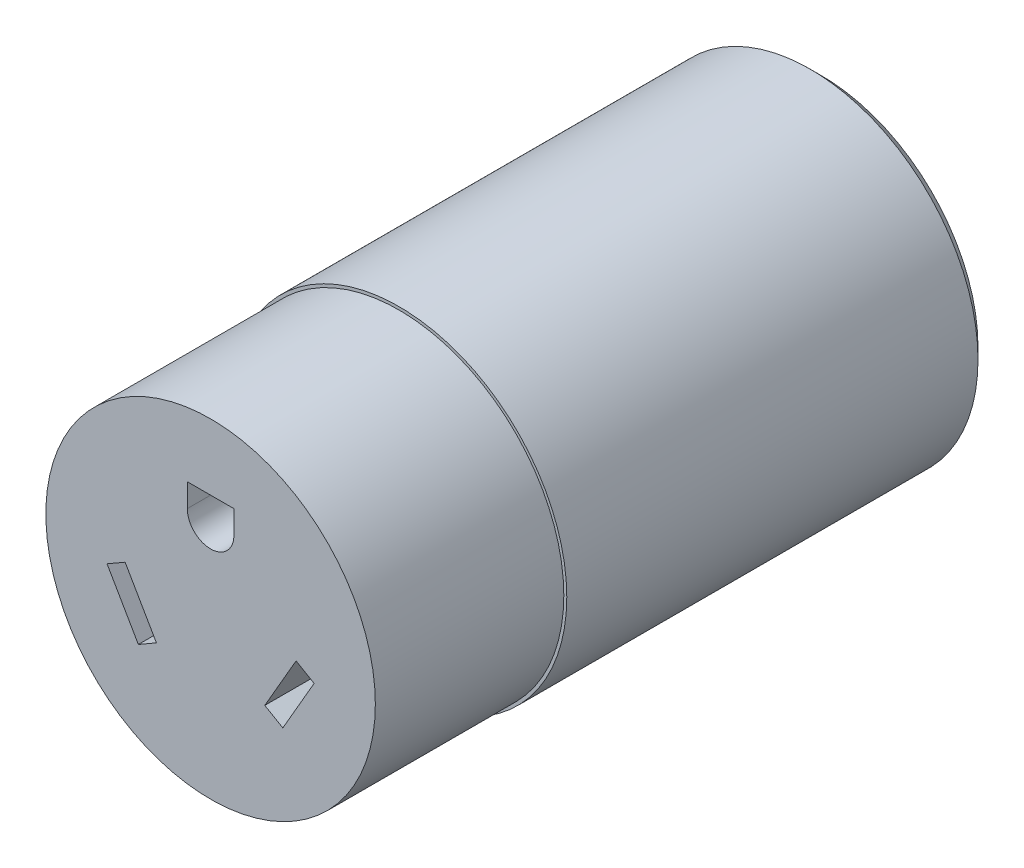
ISO-10303-21;
HEADER;
FILE_DESCRIPTION(('STEP AP214'),'2;1');
FILE_NAME('part.step','',(''),(''),'','','');
FILE_SCHEMA(('AUTOMOTIVE_DESIGN { 1 0 10303 214 1 1 1 1 }'));
ENDSEC;
DATA;
#1=APPLICATION_CONTEXT('core data for automotive mechanical design processes');
#2=APPLICATION_PROTOCOL_DEFINITION('international standard','automotive_design',2000,#1);
#3=PRODUCT_CONTEXT('',#1,'mechanical');
#4=PRODUCT('Part','Part','',(#3));
#5=PRODUCT_RELATED_PRODUCT_CATEGORY('part','',(#4));
#6=PRODUCT_DEFINITION_FORMATION('','',#4);
#7=PRODUCT_DEFINITION_CONTEXT('part definition',#1,'design');
#8=PRODUCT_DEFINITION('design','',#6,#7);
#9=PRODUCT_DEFINITION_SHAPE('','',#8);
#10=(LENGTH_UNIT() NAMED_UNIT(*) SI_UNIT(.MILLI.,.METRE.));
#11=(NAMED_UNIT(*) PLANE_ANGLE_UNIT() SI_UNIT($,.RADIAN.));
#12=(NAMED_UNIT(*) SI_UNIT($,.STERADIAN.) SOLID_ANGLE_UNIT());
#13=UNCERTAINTY_MEASURE_WITH_UNIT(LENGTH_MEASURE(1.E-05),#10,'distance_accuracy_value','');
#14=(GEOMETRIC_REPRESENTATION_CONTEXT(3) GLOBAL_UNCERTAINTY_ASSIGNED_CONTEXT((#13)) GLOBAL_UNIT_ASSIGNED_CONTEXT((#10,
#11,#12)) REPRESENTATION_CONTEXT('',''));
#15=CARTESIAN_POINT('',(0.,0.,0.));
#16=DIRECTION('',(0.,0.,1.));
#17=DIRECTION('',(1.,0.,0.));
#18=AXIS2_PLACEMENT_3D('',#15,#16,#17);
#19=CARTESIAN_POINT('',(0.,0.,0.));
#20=DIRECTION('',(0.,0.,-1.));
#21=DIRECTION('',(-1.,0.,0.));
#22=AXIS2_PLACEMENT_3D('',#19,#20,#21);
#23=PLANE('',#22);
#24=DIRECTION('',(-0.866025403784445,0.499999999999989,0.));
#25=VECTOR('',#24,1.);
#26=CARTESIAN_POINT('',(11.9732096496661,-1.45647105100187,0.));
#27=LINE('',#26,#25);
#28=CARTESIAN_POINT('',(11.9732096496661,-1.45647105100187,0.));
#29=VERTEX_POINT('',#28);
#30=CARTESIAN_POINT('',(9.88349035033421,-0.249971051001905,0.));
#31=VERTEX_POINT('',#30);
#32=EDGE_CURVE('E133',#29,#31,#27,.T.);
#33=ORIENTED_EDGE('',*,*,#32,.F.);
#34=DIRECTION('',(0.499999999999989,0.866025403784445,0.));
#35=VECTOR('',#34,1.);
#36=CARTESIAN_POINT('',(8.35370964966615,-7.72562894899747,0.));
#37=LINE('',#36,#35);
#38=CARTESIAN_POINT('',(8.35370964966615,-7.72562894899747,0.));
#39=VERTEX_POINT('',#38);
#40=EDGE_CURVE('E30',#39,#29,#37,.T.);
#41=ORIENTED_EDGE('',*,*,#40,.F.);
#42=DIRECTION('',(0.866025403784445,-0.499999999999989,0.));
#43=VECTOR('',#42,1.);
#44=CARTESIAN_POINT('',(8.35370964966615,-7.72562894899747,0.));
#45=LINE('',#44,#43);
#46=CARTESIAN_POINT('',(6.26399035033429,-6.5191289489975,0.));
#47=VERTEX_POINT('',#46);
#48=EDGE_CURVE('E124',#47,#39,#45,.T.);
#49=ORIENTED_EDGE('',*,*,#48,.F.);
#50=DIRECTION('',(-0.499999999999989,-0.866025403784445,0.));
#51=VECTOR('',#50,1.);
#52=CARTESIAN_POINT('',(6.26399035033429,-6.5191289489975,0.));
#53=LINE('',#52,#51);
#54=EDGE_CURVE('E127',#31,#47,#53,.T.);
#55=ORIENTED_EDGE('',*,*,#54,.F.);
#56=EDGE_LOOP('',(#33,#41,#49,#55));
#57=FACE_BOUND('',#56,.T.);
#58=DIRECTION('',(0.866025403784438,0.500000000000002,0.));
#59=VECTOR('',#58,1.);
#60=CARTESIAN_POINT('',(-8.35370964966592,-7.72562894899777,0.));
#61=LINE('',#60,#59);
#62=CARTESIAN_POINT('',(-8.35370964966592,-7.72562894899777,0.));
#63=VERTEX_POINT('',#62);
#64=CARTESIAN_POINT('',(-6.26399035033407,-6.51912894899777,0.));
#65=VERTEX_POINT('',#64);
#66=EDGE_CURVE('E157',#63,#65,#61,.T.);
#67=ORIENTED_EDGE('',*,*,#66,.F.);
#68=DIRECTION('',(0.500000000000001,-0.866025403784438,0.));
#69=VECTOR('',#68,1.);
#70=CARTESIAN_POINT('',(-8.35370964966592,-7.72562894899777,0.));
#71=LINE('',#70,#69);
#72=CARTESIAN_POINT('',(-11.9732096496659,-1.45647105100222,0.));
#73=VERTEX_POINT('',#72);
#74=EDGE_CURVE('E38',#73,#63,#71,.T.);
#75=ORIENTED_EDGE('',*,*,#74,.F.);
#76=DIRECTION('',(-0.866025403784438,-0.500000000000002,0.));
#77=VECTOR('',#76,1.);
#78=CARTESIAN_POINT('',(-11.9732096496659,-1.45647105100222,0.));
#79=LINE('',#78,#77);
#80=CARTESIAN_POINT('',(-9.88349035033408,-0.249971051002221,0.));
#81=VERTEX_POINT('',#80);
#82=EDGE_CURVE('E146',#81,#73,#79,.T.);
#83=ORIENTED_EDGE('',*,*,#82,.F.);
#84=DIRECTION('',(-0.500000000000001,0.866025403784438,0.));
#85=VECTOR('',#84,1.);
#86=CARTESIAN_POINT('',(-6.26399035033407,-6.51912894899777,0.));
#87=LINE('',#86,#85);
#88=EDGE_CURVE('E160',#65,#81,#87,.T.);
#89=ORIENTED_EDGE('',*,*,#88,.F.);
#90=EDGE_LOOP('',(#67,#75,#83,#89));
#91=FACE_BOUND('',#90,.T.);
#92=DIRECTION('',(0.,-1.,0.));
#93=VECTOR('',#92,1.);
#94=CARTESIAN_POINT('',(-2.6924,8.7122,0.));
#95=LINE('',#94,#93);
#96=CARTESIAN_POINT('',(-2.6924,11.4046,0.));
#97=VERTEX_POINT('',#96);
#98=CARTESIAN_POINT('',(-2.6924,8.7122,0.));
#99=VERTEX_POINT('',#98);
#100=EDGE_CURVE('E188',#97,#99,#95,.T.);
#101=ORIENTED_EDGE('',*,*,#100,.F.);
#102=DIRECTION('',(-1.,0.,0.));
#103=VECTOR('',#102,1.);
#104=CARTESIAN_POINT('',(-2.6924,11.4046,0.));
#105=LINE('',#104,#103);
#106=CARTESIAN_POINT('',(2.6924,11.4046,0.));
#107=VERTEX_POINT('',#106);
#108=EDGE_CURVE('E167',#107,#97,#105,.T.);
#109=ORIENTED_EDGE('',*,*,#108,.F.);
#110=DIRECTION('',(0.,1.,0.));
#111=VECTOR('',#110,1.);
#112=CARTESIAN_POINT('',(2.6924,11.4046,0.));
#113=LINE('',#112,#111);
#114=CARTESIAN_POINT('',(2.6924,8.7122,0.));
#115=VERTEX_POINT('',#114);
#116=EDGE_CURVE('E177',#115,#107,#113,.T.);
#117=ORIENTED_EDGE('',*,*,#116,.F.);
#118=CARTESIAN_POINT('',(0.,8.7122,0.));
#119=DIRECTION('',(0.,0.,1.));
#120=DIRECTION('',(1.,0.,0.));
#121=AXIS2_PLACEMENT_3D('',#118,#119,#120);
#122=CIRCLE('',#121,2.6924);
#123=EDGE_CURVE('E191',#99,#115,#122,.T.);
#124=ORIENTED_EDGE('',*,*,#123,.F.);
#125=EDGE_LOOP('',(#101,#109,#117,#124));
#126=FACE_BOUND('',#125,.T.);
#127=CARTESIAN_POINT('',(0.,0.,0.));
#128=DIRECTION('',(0.,0.,1.));
#129=DIRECTION('',(1.,0.,0.));
#130=AXIS2_PLACEMENT_3D('',#127,#128,#129);
#131=CIRCLE('',#130,19.05);
#132=CARTESIAN_POINT('',(19.05,0.,0.));
#133=VERTEX_POINT('',#132);
#134=EDGE_CURVE('E10',#133,#133,#131,.T.);
#135=ORIENTED_EDGE('',*,*,#134,.T.);
#136=EDGE_LOOP('',(#135));
#137=FACE_BOUND('',#136,.T.);
#138=ADVANCED_FACE('F16',(#57,#91,#126,#137),#23,.F.);
#139=CARTESIAN_POINT('',(0.,0.,0.));
#140=DIRECTION('',(0.,0.,1.));
#141=DIRECTION('',(1.,0.,0.));
#142=AXIS2_PLACEMENT_3D('',#139,#140,#141);
#143=CYLINDRICAL_SURFACE('',#142,19.05);
#144=ORIENTED_EDGE('',*,*,#134,.F.);
#145=EDGE_LOOP('',(#144));
#146=FACE_BOUND('',#145,.T.);
#147=CARTESIAN_POINT('',(0.,0.,-21.7932));
#148=DIRECTION('',(0.,0.,1.));
#149=DIRECTION('',(1.,0.,0.));
#150=AXIS2_PLACEMENT_3D('',#147,#148,#149);
#151=CIRCLE('',#150,19.05);
#152=CARTESIAN_POINT('',(19.05,0.,-21.7932));
#153=VERTEX_POINT('',#152);
#154=EDGE_CURVE('E23',#153,#153,#151,.T.);
#155=ORIENTED_EDGE('',*,*,#154,.T.);
#156=EDGE_LOOP('',(#155));
#157=FACE_BOUND('',#156,.T.);
#158=ADVANCED_FACE('F215',(#146,#157),#143,.T.);
#159=CARTESIAN_POINT('',(0.,19.05,-21.7932));
#160=DIRECTION('',(0.,0.,-1.));
#161=DIRECTION('',(-1.,0.,0.));
#162=AXIS2_PLACEMENT_3D('',#159,#160,#161);
#163=PLANE('',#162);
#164=ORIENTED_EDGE('',*,*,#154,.F.);
#165=EDGE_LOOP('',(#164));
#166=FACE_BOUND('',#165,.T.);
#167=CARTESIAN_POINT('',(0.,0.,-21.7932));
#168=DIRECTION('',(0.,0.,1.));
#169=DIRECTION('',(1.,0.,0.));
#170=AXIS2_PLACEMENT_3D('',#167,#168,#169);
#171=CIRCLE('',#170,19.3929);
#172=CARTESIAN_POINT('',(19.3929,0.,-21.7932));
#173=VERTEX_POINT('',#172);
#174=EDGE_CURVE('E210',#173,#173,#171,.T.);
#175=ORIENTED_EDGE('',*,*,#174,.T.);
#176=EDGE_LOOP('',(#175));
#177=FACE_BOUND('',#176,.T.);
#178=ADVANCED_FACE('F217',(#166,#177),#163,.F.);
#179=CARTESIAN_POINT('',(0.,0.,0.));
#180=DIRECTION('',(0.,0.,1.));
#181=DIRECTION('',(1.,0.,0.));
#182=AXIS2_PLACEMENT_3D('',#179,#180,#181);
#183=CYLINDRICAL_SURFACE('',#182,19.3929);
#184=ORIENTED_EDGE('',*,*,#174,.F.);
#185=EDGE_LOOP('',(#184));
#186=FACE_BOUND('',#185,.T.);
#187=CARTESIAN_POINT('',(0.,0.,-69.342));
#188=DIRECTION('',(0.,0.,1.));
#189=DIRECTION('',(1.,0.,0.));
#190=AXIS2_PLACEMENT_3D('',#187,#188,#189);
#191=CIRCLE('',#190,19.3929);
#192=CARTESIAN_POINT('',(19.3929,0.,-69.342));
#193=VERTEX_POINT('',#192);
#194=EDGE_CURVE('E207',#193,#193,#191,.T.);
#195=ORIENTED_EDGE('',*,*,#194,.T.);
#196=EDGE_LOOP('',(#195));
#197=FACE_BOUND('',#196,.T.);
#198=ADVANCED_FACE('F220',(#186,#197),#183,.T.);
#199=CARTESIAN_POINT('',(0.,0.,-70.612));
#200=DIRECTION('',(0.,0.,1.));
#201=DIRECTION('',(1.,0.,0.));
#202=AXIS2_PLACEMENT_3D('',#199,#200,#201);
#203=CONICAL_SURFACE('',#202,18.1229,0.785398163397454);
#204=ORIENTED_EDGE('',*,*,#194,.F.);
#205=EDGE_LOOP('',(#204));
#206=FACE_BOUND('',#205,.T.);
#207=CARTESIAN_POINT('',(0.,0.,-70.612));
#208=DIRECTION('',(0.,0.,1.));
#209=DIRECTION('',(1.,0.,0.));
#210=AXIS2_PLACEMENT_3D('',#207,#208,#209);
#211=CIRCLE('',#210,18.1229);
#212=CARTESIAN_POINT('',(18.1229,0.,-70.612));
#213=VERTEX_POINT('',#212);
#214=EDGE_CURVE('E198',#213,#213,#211,.T.);
#215=ORIENTED_EDGE('',*,*,#214,.T.);
#216=EDGE_LOOP('',(#215));
#217=FACE_BOUND('',#216,.T.);
#218=ADVANCED_FACE('F226',(#206,#217),#203,.T.);
#219=CARTESIAN_POINT('',(0.,18.1229,-70.612));
#220=DIRECTION('',(0.,0.,1.));
#221=DIRECTION('',(1.,0.,0.));
#222=AXIS2_PLACEMENT_3D('',#219,#220,#221);
#223=PLANE('',#222);
#224=ORIENTED_EDGE('',*,*,#214,.F.);
#225=EDGE_LOOP('',(#224));
#226=FACE_BOUND('',#225,.T.);
#227=ADVANCED_FACE('F232',(#226),#223,.F.);
#228=CARTESIAN_POINT('',(-2.6924,11.4046,-21.4122));
#229=DIRECTION('',(0.,1.,0.));
#230=DIRECTION('',(0.,0.,1.));
#231=AXIS2_PLACEMENT_3D('',#228,#229,#230);
#232=PLANE('',#231);
#233=ORIENTED_EDGE('',*,*,#108,.T.);
#234=DIRECTION('',(0.,0.,1.));
#235=VECTOR('',#234,1.);
#236=CARTESIAN_POINT('',(-2.6924,11.4046,-21.4122));
#237=LINE('',#236,#235);
#238=CARTESIAN_POINT('',(-2.6924,11.4046,-21.4122));
#239=VERTEX_POINT('',#238);
#240=EDGE_CURVE('E186',#239,#97,#237,.T.);
#241=ORIENTED_EDGE('',*,*,#240,.F.);
#242=DIRECTION('',(-1.,0.,0.));
#243=VECTOR('',#242,1.);
#244=CARTESIAN_POINT('',(-2.6924,11.4046,-21.4122));
#245=LINE('',#244,#243);
#246=CARTESIAN_POINT('',(2.6924,11.4046,-21.4122));
#247=VERTEX_POINT('',#246);
#248=EDGE_CURVE('E173',#247,#239,#245,.T.);
#249=ORIENTED_EDGE('',*,*,#248,.F.);
#250=DIRECTION('',(0.,0.,1.));
#251=VECTOR('',#250,1.);
#252=CARTESIAN_POINT('',(2.6924,11.4046,-21.4122));
#253=LINE('',#252,#251);
#254=EDGE_CURVE('E196',#247,#107,#253,.T.);
#255=ORIENTED_EDGE('',*,*,#254,.T.);
#256=EDGE_LOOP('',(#233,#241,#249,#255));
#257=FACE_BOUND('',#256,.T.);
#258=ADVANCED_FACE('F237',(#257),#232,.F.);
#259=CARTESIAN_POINT('',(2.6924,11.4046,-21.4122));
#260=DIRECTION('',(1.,0.,0.));
#261=DIRECTION('',(0.,1.,0.));
#262=AXIS2_PLACEMENT_3D('',#259,#260,#261);
#263=PLANE('',#262);
#264=ORIENTED_EDGE('',*,*,#116,.T.);
#265=ORIENTED_EDGE('',*,*,#254,.F.);
#266=DIRECTION('',(0.,1.,0.));
#267=VECTOR('',#266,1.);
#268=CARTESIAN_POINT('',(2.6924,11.4046,-21.4122));
#269=LINE('',#268,#267);
#270=CARTESIAN_POINT('',(2.6924,8.7122,-21.4122));
#271=VERTEX_POINT('',#270);
#272=EDGE_CURVE('E183',#271,#247,#269,.T.);
#273=ORIENTED_EDGE('',*,*,#272,.F.);
#274=DIRECTION('',(0.,0.,1.));
#275=VECTOR('',#274,1.);
#276=CARTESIAN_POINT('',(2.6924,8.7122,-21.4122));
#277=LINE('',#276,#275);
#278=EDGE_CURVE('E199',#271,#115,#277,.T.);
#279=ORIENTED_EDGE('',*,*,#278,.T.);
#280=EDGE_LOOP('',(#264,#265,#273,#279));
#281=FACE_BOUND('',#280,.T.);
#282=ADVANCED_FACE('F244',(#281),#263,.F.);
#283=CARTESIAN_POINT('',(0.,8.7122,-21.4122));
#284=DIRECTION('',(0.,0.,1.));
#285=DIRECTION('',(1.,0.,0.));
#286=AXIS2_PLACEMENT_3D('',#283,#284,#285);
#287=CYLINDRICAL_SURFACE('',#286,2.6924);
#288=ORIENTED_EDGE('',*,*,#123,.T.);
#289=ORIENTED_EDGE('',*,*,#278,.F.);
#290=CARTESIAN_POINT('',(0.,8.7122,-21.4122));
#291=DIRECTION('',(0.,0.,1.));
#292=DIRECTION('',(1.,0.,0.));
#293=AXIS2_PLACEMENT_3D('',#290,#291,#292);
#294=CIRCLE('',#293,2.6924);
#295=CARTESIAN_POINT('',(-2.6924,8.7122,-21.4122));
#296=VERTEX_POINT('',#295);
#297=EDGE_CURVE('E180',#296,#271,#294,.T.);
#298=ORIENTED_EDGE('',*,*,#297,.F.);
#299=DIRECTION('',(0.,0.,1.));
#300=VECTOR('',#299,1.);
#301=CARTESIAN_POINT('',(-2.6924,8.7122,-21.4122));
#302=LINE('',#301,#300);
#303=EDGE_CURVE('E201',#296,#99,#302,.T.);
#304=ORIENTED_EDGE('',*,*,#303,.T.);
#305=EDGE_LOOP('',(#288,#289,#298,#304));
#306=FACE_BOUND('',#305,.T.);
#307=ADVANCED_FACE('F273',(#306),#287,.F.);
#308=CARTESIAN_POINT('',(-2.6924,8.7122,-21.4122));
#309=DIRECTION('',(-1.,0.,0.));
#310=DIRECTION('',(0.,-1.,0.));
#311=AXIS2_PLACEMENT_3D('',#308,#309,#310);
#312=PLANE('',#311);
#313=ORIENTED_EDGE('',*,*,#100,.T.);
#314=ORIENTED_EDGE('',*,*,#303,.F.);
#315=DIRECTION('',(0.,-1.,0.));
#316=VECTOR('',#315,1.);
#317=CARTESIAN_POINT('',(-2.6924,8.7122,-21.4122));
#318=LINE('',#317,#316);
#319=EDGE_CURVE('E176',#239,#296,#318,.T.);
#320=ORIENTED_EDGE('',*,*,#319,.F.);
#321=ORIENTED_EDGE('',*,*,#240,.T.);
#322=EDGE_LOOP('',(#313,#314,#320,#321));
#323=FACE_BOUND('',#322,.T.);
#324=ADVANCED_FACE('F266',(#323),#312,.F.);
#325=CARTESIAN_POINT('',(0.,8.7122,-21.4122));
#326=DIRECTION('',(0.,0.,1.));
#327=DIRECTION('',(1.,0.,0.));
#328=AXIS2_PLACEMENT_3D('',#325,#326,#327);
#329=PLANE('',#328);
#330=ORIENTED_EDGE('',*,*,#248,.T.);
#331=ORIENTED_EDGE('',*,*,#319,.T.);
#332=ORIENTED_EDGE('',*,*,#297,.T.);
#333=ORIENTED_EDGE('',*,*,#272,.T.);
#334=EDGE_LOOP('',(#330,#331,#332,#333));
#335=FACE_BOUND('',#334,.T.);
#336=ADVANCED_FACE('F275',(#335),#329,.T.);
#337=CARTESIAN_POINT('',(-8.35370964966592,-7.72562894899777,-15.875));
#338=DIRECTION('',(-0.866025403784438,-0.500000000000001,0.));
#339=DIRECTION('',(0.500000000000001,-0.866025403784438,0.));
#340=AXIS2_PLACEMENT_3D('',#337,#338,#339);
#341=PLANE('',#340);
#342=ORIENTED_EDGE('',*,*,#74,.T.);
#343=DIRECTION('',(0.,0.,1.));
#344=VECTOR('',#343,1.);
#345=CARTESIAN_POINT('',(-8.35370964966592,-7.72562894899777,-15.875));
#346=LINE('',#345,#344);
#347=CARTESIAN_POINT('',(-8.35370964966592,-7.72562894899777,-15.875));
#348=VERTEX_POINT('',#347);
#349=EDGE_CURVE('E155',#348,#63,#346,.T.);
#350=ORIENTED_EDGE('',*,*,#349,.F.);
#351=DIRECTION('',(0.500000000000001,-0.866025403784438,0.));
#352=VECTOR('',#351,1.);
#353=CARTESIAN_POINT('',(-8.35370964966592,-7.72562894899777,-15.875));
#354=LINE('',#353,#352);
#355=CARTESIAN_POINT('',(-11.9732096496659,-1.45647105100222,-15.875));
#356=VERTEX_POINT('',#355);
#357=EDGE_CURVE('E142',#356,#348,#354,.T.);
#358=ORIENTED_EDGE('',*,*,#357,.F.);
#359=DIRECTION('',(0.,0.,1.));
#360=VECTOR('',#359,1.);
#361=CARTESIAN_POINT('',(-11.9732096496659,-1.45647105100222,-15.875));
#362=LINE('',#361,#360);
#363=EDGE_CURVE('E165',#356,#73,#362,.T.);
#364=ORIENTED_EDGE('',*,*,#363,.T.);
#365=EDGE_LOOP('',(#342,#350,#358,#364));
#366=FACE_BOUND('',#365,.T.);
#367=ADVANCED_FACE('F277',(#366),#341,.F.);
#368=CARTESIAN_POINT('',(-11.9732096496659,-1.45647105100222,-15.875));
#369=DIRECTION('',(-0.500000000000002,0.866025403784438,0.));
#370=DIRECTION('',(-0.866025403784438,-0.500000000000002,0.));
#371=AXIS2_PLACEMENT_3D('',#368,#369,#370);
#372=PLANE('',#371);
#373=ORIENTED_EDGE('',*,*,#82,.T.);
#374=ORIENTED_EDGE('',*,*,#363,.F.);
#375=DIRECTION('',(-0.866025403784438,-0.500000000000002,0.));
#376=VECTOR('',#375,1.);
#377=CARTESIAN_POINT('',(-11.9732096496659,-1.45647105100222,-15.875));
#378=LINE('',#377,#376);
#379=CARTESIAN_POINT('',(-9.88349035033408,-0.249971051002221,-15.875));
#380=VERTEX_POINT('',#379);
#381=EDGE_CURVE('E152',#380,#356,#378,.T.);
#382=ORIENTED_EDGE('',*,*,#381,.F.);
#383=DIRECTION('',(0.,0.,1.));
#384=VECTOR('',#383,1.);
#385=CARTESIAN_POINT('',(-9.88349035033408,-0.249971051002221,-15.875));
#386=LINE('',#385,#384);
#387=EDGE_CURVE('E168',#380,#81,#386,.T.);
#388=ORIENTED_EDGE('',*,*,#387,.T.);
#389=EDGE_LOOP('',(#373,#374,#382,#388));
#390=FACE_BOUND('',#389,.T.);
#391=ADVANCED_FACE('F284',(#390),#372,.F.);
#392=CARTESIAN_POINT('',(-6.26399035033407,-6.51912894899777,-15.875));
#393=DIRECTION('',(0.866025403784438,0.500000000000001,0.));
#394=DIRECTION('',(-0.500000000000001,0.866025403784438,0.));
#395=AXIS2_PLACEMENT_3D('',#392,#393,#394);
#396=PLANE('',#395);
#397=ORIENTED_EDGE('',*,*,#88,.T.);
#398=ORIENTED_EDGE('',*,*,#387,.F.);
#399=DIRECTION('',(-0.500000000000001,0.866025403784438,0.));
#400=VECTOR('',#399,1.);
#401=CARTESIAN_POINT('',(-6.26399035033407,-6.51912894899777,-15.875));
#402=LINE('',#401,#400);
#403=CARTESIAN_POINT('',(-6.26399035033407,-6.51912894899777,-15.875));
#404=VERTEX_POINT('',#403);
#405=EDGE_CURVE('E149',#404,#380,#402,.T.);
#406=ORIENTED_EDGE('',*,*,#405,.F.);
#407=DIRECTION('',(0.,0.,1.));
#408=VECTOR('',#407,1.);
#409=CARTESIAN_POINT('',(-6.26399035033407,-6.51912894899777,-15.875));
#410=LINE('',#409,#408);
#411=EDGE_CURVE('E170',#404,#65,#410,.T.);
#412=ORIENTED_EDGE('',*,*,#411,.T.);
#413=EDGE_LOOP('',(#397,#398,#406,#412));
#414=FACE_BOUND('',#413,.T.);
#415=ADVANCED_FACE('F341',(#414),#396,.F.);
#416=CARTESIAN_POINT('',(-8.35370964966592,-7.72562894899777,-15.875));
#417=DIRECTION('',(0.500000000000002,-0.866025403784438,0.));
#418=DIRECTION('',(0.866025403784438,0.500000000000002,0.));
#419=AXIS2_PLACEMENT_3D('',#416,#417,#418);
#420=PLANE('',#419);
#421=ORIENTED_EDGE('',*,*,#66,.T.);
#422=ORIENTED_EDGE('',*,*,#411,.F.);
#423=DIRECTION('',(0.866025403784438,0.500000000000002,0.));
#424=VECTOR('',#423,1.);
#425=CARTESIAN_POINT('',(-8.35370964966592,-7.72562894899777,-15.875));
#426=LINE('',#425,#424);
#427=EDGE_CURVE('E145',#348,#404,#426,.T.);
#428=ORIENTED_EDGE('',*,*,#427,.F.);
#429=ORIENTED_EDGE('',*,*,#349,.T.);
#430=EDGE_LOOP('',(#421,#422,#428,#429));
#431=FACE_BOUND('',#430,.T.);
#432=ADVANCED_FACE('F349',(#431),#420,.F.);
#433=CARTESIAN_POINT('',(-11.9732096496659,-1.45647105100222,-15.875));
#434=DIRECTION('',(0.,0.,-1.));
#435=DIRECTION('',(-1.,0.,0.));
#436=AXIS2_PLACEMENT_3D('',#433,#434,#435);
#437=PLANE('',#436);
#438=ORIENTED_EDGE('',*,*,#357,.T.);
#439=ORIENTED_EDGE('',*,*,#427,.T.);
#440=ORIENTED_EDGE('',*,*,#405,.T.);
#441=ORIENTED_EDGE('',*,*,#381,.T.);
#442=EDGE_LOOP('',(#438,#439,#440,#441));
#443=FACE_BOUND('',#442,.T.);
#444=ADVANCED_FACE('F357',(#443),#437,.F.);
#445=CARTESIAN_POINT('',(8.35370964966615,-7.72562894899747,-15.875));
#446=DIRECTION('',(0.866025403784445,-0.499999999999989,0.));
#447=DIRECTION('',(0.49999999999999,0.866025403784445,0.));
#448=AXIS2_PLACEMENT_3D('',#445,#446,#447);
#449=PLANE('',#448);
#450=ORIENTED_EDGE('',*,*,#40,.T.);
#451=DIRECTION('',(0.,0.,1.));
#452=VECTOR('',#451,1.);
#453=CARTESIAN_POINT('',(11.9732096496661,-1.45647105100187,-15.875));
#454=LINE('',#453,#452);
#455=CARTESIAN_POINT('',(11.9732096496661,-1.45647105100187,-15.875));
#456=VERTEX_POINT('',#455);
#457=EDGE_CURVE('E102',#456,#29,#454,.T.);
#458=ORIENTED_EDGE('',*,*,#457,.F.);
#459=DIRECTION('',(0.499999999999989,0.866025403784445,0.));
#460=VECTOR('',#459,1.);
#461=CARTESIAN_POINT('',(8.35370964966615,-7.72562894899747,-15.875));
#462=LINE('',#461,#460);
#463=CARTESIAN_POINT('',(8.35370964966615,-7.72562894899747,-15.875));
#464=VERTEX_POINT('',#463);
#465=EDGE_CURVE('E106',#464,#456,#462,.T.);
#466=ORIENTED_EDGE('',*,*,#465,.F.);
#467=DIRECTION('',(0.,0.,1.));
#468=VECTOR('',#467,1.);
#469=CARTESIAN_POINT('',(8.35370964966615,-7.72562894899747,-15.875));
#470=LINE('',#469,#468);
#471=EDGE_CURVE('E137',#464,#39,#470,.T.);
#472=ORIENTED_EDGE('',*,*,#471,.T.);
#473=EDGE_LOOP('',(#450,#458,#466,#472));
#474=FACE_BOUND('',#473,.T.);
#475=ADVANCED_FACE('F104',(#474),#449,.F.);
#476=CARTESIAN_POINT('',(8.35370964966615,-7.72562894899747,-15.875));
#477=DIRECTION('',(-0.499999999999989,-0.866025403784445,0.));
#478=DIRECTION('',(0.866025403784445,-0.499999999999989,0.));
#479=AXIS2_PLACEMENT_3D('',#476,#477,#478);
#480=PLANE('',#479);
#481=ORIENTED_EDGE('',*,*,#48,.T.);
#482=ORIENTED_EDGE('',*,*,#471,.F.);
#483=DIRECTION('',(0.866025403784445,-0.499999999999989,0.));
#484=VECTOR('',#483,1.);
#485=CARTESIAN_POINT('',(8.35370964966615,-7.72562894899747,-15.875));
#486=LINE('',#485,#484);
#487=CARTESIAN_POINT('',(6.26399035033429,-6.5191289489975,-15.875));
#488=VERTEX_POINT('',#487);
#489=EDGE_CURVE('E112',#488,#464,#486,.T.);
#490=ORIENTED_EDGE('',*,*,#489,.F.);
#491=DIRECTION('',(0.,0.,1.));
#492=VECTOR('',#491,1.);
#493=CARTESIAN_POINT('',(6.26399035033429,-6.5191289489975,-15.875));
#494=LINE('',#493,#492);
#495=EDGE_CURVE('E139',#488,#47,#494,.T.);
#496=ORIENTED_EDGE('',*,*,#495,.T.);
#497=EDGE_LOOP('',(#481,#482,#490,#496));
#498=FACE_BOUND('',#497,.T.);
#499=ADVANCED_FACE('F371',(#498),#480,.F.);
#500=CARTESIAN_POINT('',(6.26399035033429,-6.5191289489975,-15.875));
#501=DIRECTION('',(-0.866025403784445,0.499999999999989,0.));
#502=DIRECTION('',(-0.49999999999999,-0.866025403784445,0.));
#503=AXIS2_PLACEMENT_3D('',#500,#501,#502);
#504=PLANE('',#503);
#505=ORIENTED_EDGE('',*,*,#54,.T.);
#506=ORIENTED_EDGE('',*,*,#495,.F.);
#507=DIRECTION('',(-0.499999999999989,-0.866025403784445,0.));
#508=VECTOR('',#507,1.);
#509=CARTESIAN_POINT('',(6.26399035033429,-6.5191289489975,-15.875));
#510=LINE('',#509,#508);
#511=CARTESIAN_POINT('',(9.88349035033421,-0.249971051001905,-15.875));
#512=VERTEX_POINT('',#511);
#513=EDGE_CURVE('E120',#512,#488,#510,.T.);
#514=ORIENTED_EDGE('',*,*,#513,.F.);
#515=DIRECTION('',(0.,0.,1.));
#516=VECTOR('',#515,1.);
#517=CARTESIAN_POINT('',(9.88349035033421,-0.249971051001905,-15.875));
#518=LINE('',#517,#516);
#519=EDGE_CURVE('E111',#512,#31,#518,.T.);
#520=ORIENTED_EDGE('',*,*,#519,.T.);
#521=EDGE_LOOP('',(#505,#506,#514,#520));
#522=FACE_BOUND('',#521,.T.);
#523=ADVANCED_FACE('F378',(#522),#504,.F.);
#524=CARTESIAN_POINT('',(11.9732096496661,-1.45647105100187,-15.875));
#525=DIRECTION('',(0.499999999999989,0.866025403784445,0.));
#526=DIRECTION('',(-0.866025403784445,0.499999999999989,0.));
#527=AXIS2_PLACEMENT_3D('',#524,#525,#526);
#528=PLANE('',#527);
#529=ORIENTED_EDGE('',*,*,#32,.T.);
#530=ORIENTED_EDGE('',*,*,#519,.F.);
#531=DIRECTION('',(-0.866025403784445,0.499999999999989,0.));
#532=VECTOR('',#531,1.);
#533=CARTESIAN_POINT('',(11.9732096496661,-1.45647105100187,-15.875));
#534=LINE('',#533,#532);
#535=EDGE_CURVE('E115',#456,#512,#534,.T.);
#536=ORIENTED_EDGE('',*,*,#535,.F.);
#537=ORIENTED_EDGE('',*,*,#457,.T.);
#538=EDGE_LOOP('',(#529,#530,#536,#537));
#539=FACE_BOUND('',#538,.T.);
#540=ADVANCED_FACE('F116',(#539),#528,.F.);
#541=CARTESIAN_POINT('',(11.9732096496661,-1.45647105100187,-15.875));
#542=DIRECTION('',(0.,0.,1.));
#543=DIRECTION('',(1.,0.,0.));
#544=AXIS2_PLACEMENT_3D('',#541,#542,#543);
#545=PLANE('',#544);
#546=ORIENTED_EDGE('',*,*,#465,.T.);
#547=ORIENTED_EDGE('',*,*,#535,.T.);
#548=ORIENTED_EDGE('',*,*,#513,.T.);
#549=ORIENTED_EDGE('',*,*,#489,.T.);
#550=EDGE_LOOP('',(#546,#547,#548,#549));
#551=FACE_BOUND('',#550,.T.);
#552=ADVANCED_FACE('F122',(#551),#545,.T.);
#553=CLOSED_SHELL('',(#138,#158,#178,#198,#218,#227,#258,#282,#307,#324,#336,#367,#391,#415,
#432,#444,#475,#499,#523,#540,#552));
#554=MANIFOLD_SOLID_BREP('B1',#553);
#555=ADVANCED_BREP_SHAPE_REPRESENTATION('',(#18,#554),#14);
#556=SHAPE_DEFINITION_REPRESENTATION(#9,#555);
ENDSEC;
END-ISO-10303-21;
